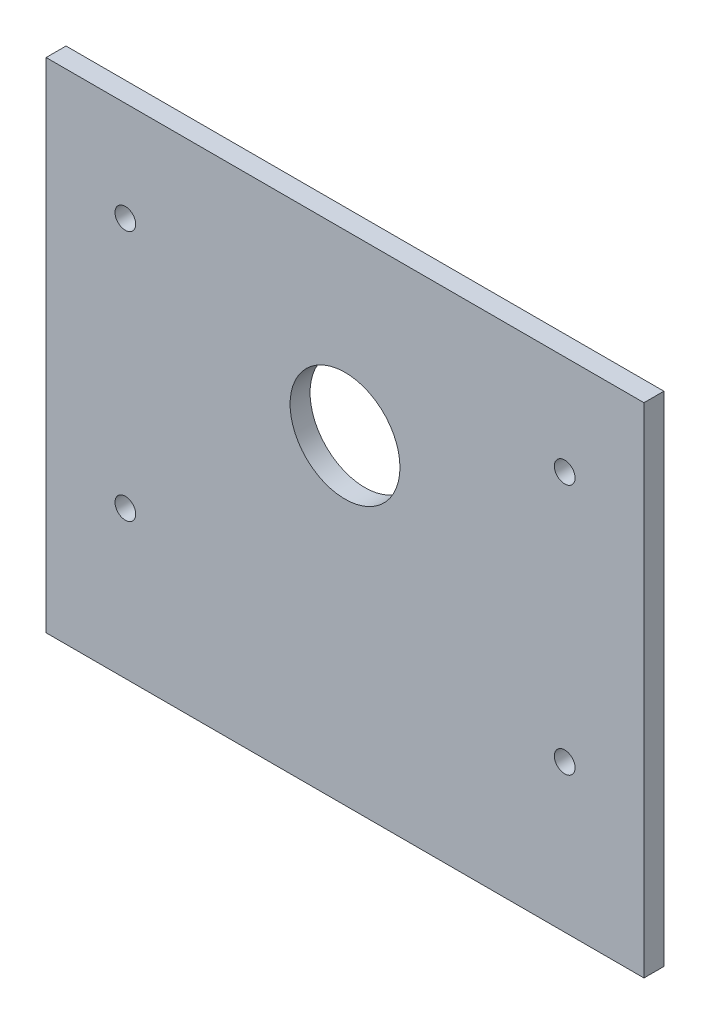
ISO-10303-21;
HEADER;
FILE_DESCRIPTION(('STEP AP214'),'2;1');
FILE_NAME('part.step','',(''),(''),'','','');
FILE_SCHEMA(('AUTOMOTIVE_DESIGN { 1 0 10303 214 1 1 1 1 }'));
ENDSEC;
DATA;
#1=APPLICATION_CONTEXT('core data for automotive mechanical design processes');
#2=APPLICATION_PROTOCOL_DEFINITION('international standard','automotive_design',2000,#1);
#3=PRODUCT_CONTEXT('',#1,'mechanical');
#4=PRODUCT('Part','Part','',(#3));
#5=PRODUCT_RELATED_PRODUCT_CATEGORY('part','',(#4));
#6=PRODUCT_DEFINITION_FORMATION('','',#4);
#7=PRODUCT_DEFINITION_CONTEXT('part definition',#1,'design');
#8=PRODUCT_DEFINITION('design','',#6,#7);
#9=PRODUCT_DEFINITION_SHAPE('','',#8);
#10=(LENGTH_UNIT() NAMED_UNIT(*) SI_UNIT(.MILLI.,.METRE.));
#11=(NAMED_UNIT(*) PLANE_ANGLE_UNIT() SI_UNIT($,.RADIAN.));
#12=(NAMED_UNIT(*) SI_UNIT($,.STERADIAN.) SOLID_ANGLE_UNIT());
#13=UNCERTAINTY_MEASURE_WITH_UNIT(LENGTH_MEASURE(1.E-05),#10,'distance_accuracy_value','');
#14=(GEOMETRIC_REPRESENTATION_CONTEXT(3) GLOBAL_UNCERTAINTY_ASSIGNED_CONTEXT((#13)) GLOBAL_UNIT_ASSIGNED_CONTEXT((#10,
#11,#12)) REPRESENTATION_CONTEXT('',''));
#15=CARTESIAN_POINT('',(0.,0.,0.));
#16=DIRECTION('',(0.,0.,1.));
#17=DIRECTION('',(1.,0.,0.));
#18=AXIS2_PLACEMENT_3D('',#15,#16,#17);
#19=CARTESIAN_POINT('',(38.1,-31.75,-2.54));
#20=DIRECTION('',(1.,0.,0.));
#21=DIRECTION('',(0.,0.,-1.));
#22=AXIS2_PLACEMENT_3D('',#19,#20,#21);
#23=PLANE('',#22);
#24=DIRECTION('',(0.,1.,0.));
#25=VECTOR('',#24,1.);
#26=CARTESIAN_POINT('',(38.1,-31.75,0.));
#27=LINE('',#26,#25);
#28=CARTESIAN_POINT('',(38.1,-31.75,0.));
#29=VERTEX_POINT('',#28);
#30=CARTESIAN_POINT('',(38.1,31.75,0.));
#31=VERTEX_POINT('',#30);
#32=EDGE_CURVE('E98',#29,#31,#27,.T.);
#33=ORIENTED_EDGE('',*,*,#32,.F.);
#34=DIRECTION('',(0.,0.,1.));
#35=VECTOR('',#34,1.);
#36=CARTESIAN_POINT('',(38.1,-31.75,-2.54));
#37=LINE('',#36,#35);
#38=CARTESIAN_POINT('',(38.1,-31.75,-2.54));
#39=VERTEX_POINT('',#38);
#40=EDGE_CURVE('E11',#39,#29,#37,.T.);
#41=ORIENTED_EDGE('',*,*,#40,.F.);
#42=DIRECTION('',(0.,1.,0.));
#43=VECTOR('',#42,1.);
#44=CARTESIAN_POINT('',(38.1,-31.75,-2.54));
#45=LINE('',#44,#43);
#46=CARTESIAN_POINT('',(38.1,31.75,-2.54));
#47=VERTEX_POINT('',#46);
#48=EDGE_CURVE('E91',#39,#47,#45,.T.);
#49=ORIENTED_EDGE('',*,*,#48,.T.);
#50=DIRECTION('',(0.,0.,1.));
#51=VECTOR('',#50,1.);
#52=CARTESIAN_POINT('',(38.1,31.75,-2.54));
#53=LINE('',#52,#51);
#54=EDGE_CURVE('E36',#47,#31,#53,.T.);
#55=ORIENTED_EDGE('',*,*,#54,.T.);
#56=EDGE_LOOP('',(#33,#41,#49,#55));
#57=FACE_BOUND('',#56,.T.);
#58=ADVANCED_FACE('F33',(#57),#23,.T.);
#59=CARTESIAN_POINT('',(-38.1,-31.75,-2.54));
#60=DIRECTION('',(0.,-1.,0.));
#61=DIRECTION('',(0.,0.,-1.));
#62=AXIS2_PLACEMENT_3D('',#59,#60,#61);
#63=PLANE('',#62);
#64=DIRECTION('',(1.,0.,0.));
#65=VECTOR('',#64,1.);
#66=CARTESIAN_POINT('',(-38.1,-31.75,0.));
#67=LINE('',#66,#65);
#68=CARTESIAN_POINT('',(-38.1,-31.75,0.));
#69=VERTEX_POINT('',#68);
#70=EDGE_CURVE('E93',#69,#29,#67,.T.);
#71=ORIENTED_EDGE('',*,*,#70,.F.);
#72=DIRECTION('',(0.,0.,1.));
#73=VECTOR('',#72,1.);
#74=CARTESIAN_POINT('',(-38.1,-31.75,-2.54));
#75=LINE('',#74,#73);
#76=CARTESIAN_POINT('',(-38.1,-31.75,-2.54));
#77=VERTEX_POINT('',#76);
#78=EDGE_CURVE('E42',#77,#69,#75,.T.);
#79=ORIENTED_EDGE('',*,*,#78,.F.);
#80=DIRECTION('',(1.,0.,0.));
#81=VECTOR('',#80,1.);
#82=CARTESIAN_POINT('',(-38.1,-31.75,-2.54));
#83=LINE('',#82,#81);
#84=EDGE_CURVE('E88',#77,#39,#83,.T.);
#85=ORIENTED_EDGE('',*,*,#84,.T.);
#86=ORIENTED_EDGE('',*,*,#40,.T.);
#87=EDGE_LOOP('',(#71,#79,#85,#86));
#88=FACE_BOUND('',#87,.T.);
#89=ADVANCED_FACE('F109',(#88),#63,.T.);
#90=CARTESIAN_POINT('',(-38.1,-31.75,-2.54));
#91=DIRECTION('',(-1.,0.,0.));
#92=DIRECTION('',(0.,0.,1.));
#93=AXIS2_PLACEMENT_3D('',#90,#91,#92);
#94=PLANE('',#93);
#95=DIRECTION('',(0.,-1.,0.));
#96=VECTOR('',#95,1.);
#97=CARTESIAN_POINT('',(-38.1,-31.75,0.));
#98=LINE('',#97,#96);
#99=CARTESIAN_POINT('',(-38.1,31.75,0.));
#100=VERTEX_POINT('',#99);
#101=EDGE_CURVE('E83',#100,#69,#98,.T.);
#102=ORIENTED_EDGE('',*,*,#101,.F.);
#103=DIRECTION('',(0.,0.,1.));
#104=VECTOR('',#103,1.);
#105=CARTESIAN_POINT('',(-38.1,31.75,-2.54));
#106=LINE('',#105,#104);
#107=CARTESIAN_POINT('',(-38.1,31.75,-2.54));
#108=VERTEX_POINT('',#107);
#109=EDGE_CURVE('E78',#108,#100,#106,.T.);
#110=ORIENTED_EDGE('',*,*,#109,.F.);
#111=DIRECTION('',(0.,-1.,0.));
#112=VECTOR('',#111,1.);
#113=CARTESIAN_POINT('',(-38.1,-31.75,-2.54));
#114=LINE('',#113,#112);
#115=EDGE_CURVE('E81',#108,#77,#114,.T.);
#116=ORIENTED_EDGE('',*,*,#115,.T.);
#117=ORIENTED_EDGE('',*,*,#78,.T.);
#118=EDGE_LOOP('',(#102,#110,#116,#117));
#119=FACE_BOUND('',#118,.T.);
#120=ADVANCED_FACE('F80',(#119),#94,.T.);
#121=CARTESIAN_POINT('',(-38.1,31.75,-2.54));
#122=DIRECTION('',(0.,1.,0.));
#123=DIRECTION('',(0.,0.,1.));
#124=AXIS2_PLACEMENT_3D('',#121,#122,#123);
#125=PLANE('',#124);
#126=DIRECTION('',(-1.,0.,0.));
#127=VECTOR('',#126,1.);
#128=CARTESIAN_POINT('',(-38.1,31.75,0.));
#129=LINE('',#128,#127);
#130=EDGE_CURVE('E101',#31,#100,#129,.T.);
#131=ORIENTED_EDGE('',*,*,#130,.F.);
#132=ORIENTED_EDGE('',*,*,#54,.F.);
#133=DIRECTION('',(-1.,0.,0.));
#134=VECTOR('',#133,1.);
#135=CARTESIAN_POINT('',(-38.1,31.75,-2.54));
#136=LINE('',#135,#134);
#137=EDGE_CURVE('E87',#47,#108,#136,.T.);
#138=ORIENTED_EDGE('',*,*,#137,.T.);
#139=ORIENTED_EDGE('',*,*,#109,.T.);
#140=EDGE_LOOP('',(#131,#132,#138,#139));
#141=FACE_BOUND('',#140,.T.);
#142=ADVANCED_FACE('F90',(#141),#125,.T.);
#143=CARTESIAN_POINT('',(0.,0.,-2.54));
#144=DIRECTION('',(0.,0.,-1.));
#145=DIRECTION('',(-1.,0.,0.));
#146=AXIS2_PLACEMENT_3D('',#143,#144,#145);
#147=PLANE('',#146);
#148=CARTESIAN_POINT('',(0.,9.05,-2.54));
#149=DIRECTION('',(0.,0.,1.));
#150=DIRECTION('',(1.,0.,0.));
#151=AXIS2_PLACEMENT_3D('',#148,#149,#150);
#152=CIRCLE('',#151,7.);
#153=CARTESIAN_POINT('',(7.,9.05,-2.54));
#154=VERTEX_POINT('',#153);
#155=EDGE_CURVE('E154',#154,#154,#152,.T.);
#156=ORIENTED_EDGE('',*,*,#155,.T.);
#157=EDGE_LOOP('',(#156));
#158=FACE_BOUND('',#157,.T.);
#159=CARTESIAN_POINT('',(28.,-12.95,-2.54));
#160=DIRECTION('',(0.,0.,1.));
#161=DIRECTION('',(1.,0.,0.));
#162=AXIS2_PLACEMENT_3D('',#159,#160,#161);
#163=CIRCLE('',#162,1.3208);
#164=CARTESIAN_POINT('',(29.3208,-12.95,-2.54));
#165=VERTEX_POINT('',#164);
#166=EDGE_CURVE('E162',#165,#165,#163,.T.);
#167=ORIENTED_EDGE('',*,*,#166,.T.);
#168=EDGE_LOOP('',(#167));
#169=FACE_BOUND('',#168,.T.);
#170=CARTESIAN_POINT('',(-28.,-12.95,-2.54));
#171=DIRECTION('',(0.,0.,1.));
#172=DIRECTION('',(1.,0.,0.));
#173=AXIS2_PLACEMENT_3D('',#170,#171,#172);
#174=CIRCLE('',#173,1.3208);
#175=CARTESIAN_POINT('',(-26.6792,-12.95,-2.54));
#176=VERTEX_POINT('',#175);
#177=EDGE_CURVE('E168',#176,#176,#174,.T.);
#178=ORIENTED_EDGE('',*,*,#177,.T.);
#179=EDGE_LOOP('',(#178));
#180=FACE_BOUND('',#179,.T.);
#181=CARTESIAN_POINT('',(28.,19.05,-2.54));
#182=DIRECTION('',(0.,0.,1.));
#183=DIRECTION('',(1.,0.,0.));
#184=AXIS2_PLACEMENT_3D('',#181,#182,#183);
#185=CIRCLE('',#184,1.3208);
#186=CARTESIAN_POINT('',(29.3208,19.05,-2.54));
#187=VERTEX_POINT('',#186);
#188=EDGE_CURVE('E174',#187,#187,#185,.T.);
#189=ORIENTED_EDGE('',*,*,#188,.T.);
#190=EDGE_LOOP('',(#189));
#191=FACE_BOUND('',#190,.T.);
#192=CARTESIAN_POINT('',(-28.,19.05,-2.54));
#193=DIRECTION('',(0.,0.,1.));
#194=DIRECTION('',(1.,0.,0.));
#195=AXIS2_PLACEMENT_3D('',#192,#193,#194);
#196=CIRCLE('',#195,1.3208);
#197=CARTESIAN_POINT('',(-26.6792,19.05,-2.54));
#198=VERTEX_POINT('',#197);
#199=EDGE_CURVE('E102',#198,#198,#196,.T.);
#200=ORIENTED_EDGE('',*,*,#199,.T.);
#201=EDGE_LOOP('',(#200));
#202=FACE_BOUND('',#201,.T.);
#203=ORIENTED_EDGE('',*,*,#48,.F.);
#204=ORIENTED_EDGE('',*,*,#84,.F.);
#205=ORIENTED_EDGE('',*,*,#115,.F.);
#206=ORIENTED_EDGE('',*,*,#137,.F.);
#207=EDGE_LOOP('',(#203,#204,#205,#206));
#208=FACE_BOUND('',#207,.T.);
#209=ADVANCED_FACE('F86',(#158,#169,#180,#191,#202,#208),#147,.T.);
#210=CARTESIAN_POINT('',(0.,0.,0.));
#211=DIRECTION('',(0.,0.,-1.));
#212=DIRECTION('',(-1.,0.,0.));
#213=AXIS2_PLACEMENT_3D('',#210,#211,#212);
#214=PLANE('',#213);
#215=CARTESIAN_POINT('',(0.,9.05,0.));
#216=DIRECTION('',(0.,0.,1.));
#217=DIRECTION('',(1.,0.,0.));
#218=AXIS2_PLACEMENT_3D('',#215,#216,#217);
#219=CIRCLE('',#218,7.);
#220=CARTESIAN_POINT('',(7.,9.05,0.));
#221=VERTEX_POINT('',#220);
#222=EDGE_CURVE('E157',#221,#221,#219,.T.);
#223=ORIENTED_EDGE('',*,*,#222,.F.);
#224=EDGE_LOOP('',(#223));
#225=FACE_BOUND('',#224,.T.);
#226=CARTESIAN_POINT('',(28.,-12.95,0.));
#227=DIRECTION('',(0.,0.,1.));
#228=DIRECTION('',(1.,0.,0.));
#229=AXIS2_PLACEMENT_3D('',#226,#227,#228);
#230=CIRCLE('',#229,1.3208);
#231=CARTESIAN_POINT('',(29.3208,-12.95,0.));
#232=VERTEX_POINT('',#231);
#233=EDGE_CURVE('E159',#232,#232,#230,.T.);
#234=ORIENTED_EDGE('',*,*,#233,.F.);
#235=EDGE_LOOP('',(#234));
#236=FACE_BOUND('',#235,.T.);
#237=CARTESIAN_POINT('',(-28.,-12.95,0.));
#238=DIRECTION('',(0.,0.,1.));
#239=DIRECTION('',(1.,0.,0.));
#240=AXIS2_PLACEMENT_3D('',#237,#238,#239);
#241=CIRCLE('',#240,1.3208);
#242=CARTESIAN_POINT('',(-26.6792,-12.95,0.));
#243=VERTEX_POINT('',#242);
#244=EDGE_CURVE('E165',#243,#243,#241,.T.);
#245=ORIENTED_EDGE('',*,*,#244,.F.);
#246=EDGE_LOOP('',(#245));
#247=FACE_BOUND('',#246,.T.);
#248=CARTESIAN_POINT('',(28.,19.05,0.));
#249=DIRECTION('',(0.,0.,1.));
#250=DIRECTION('',(1.,0.,0.));
#251=AXIS2_PLACEMENT_3D('',#248,#249,#250);
#252=CIRCLE('',#251,1.3208);
#253=CARTESIAN_POINT('',(29.3208,19.05,0.));
#254=VERTEX_POINT('',#253);
#255=EDGE_CURVE('E171',#254,#254,#252,.T.);
#256=ORIENTED_EDGE('',*,*,#255,.F.);
#257=EDGE_LOOP('',(#256));
#258=FACE_BOUND('',#257,.T.);
#259=CARTESIAN_POINT('',(-28.,19.05,0.));
#260=DIRECTION('',(0.,0.,1.));
#261=DIRECTION('',(1.,0.,0.));
#262=AXIS2_PLACEMENT_3D('',#259,#260,#261);
#263=CIRCLE('',#262,1.3208);
#264=CARTESIAN_POINT('',(-26.6792,19.05,0.));
#265=VERTEX_POINT('',#264);
#266=EDGE_CURVE('E177',#265,#265,#263,.T.);
#267=ORIENTED_EDGE('',*,*,#266,.F.);
#268=EDGE_LOOP('',(#267));
#269=FACE_BOUND('',#268,.T.);
#270=ORIENTED_EDGE('',*,*,#32,.T.);
#271=ORIENTED_EDGE('',*,*,#130,.T.);
#272=ORIENTED_EDGE('',*,*,#101,.T.);
#273=ORIENTED_EDGE('',*,*,#70,.T.);
#274=EDGE_LOOP('',(#270,#271,#272,#273));
#275=FACE_BOUND('',#274,.T.);
#276=ADVANCED_FACE('F108',(#225,#236,#247,#258,#269,#275),#214,.F.);
#277=CARTESIAN_POINT('',(-28.,19.05,-2.54));
#278=DIRECTION('',(0.,0.,1.));
#279=DIRECTION('',(1.,0.,0.));
#280=AXIS2_PLACEMENT_3D('',#277,#278,#279);
#281=CYLINDRICAL_SURFACE('',#280,1.3208);
#282=ORIENTED_EDGE('',*,*,#199,.F.);
#283=EDGE_LOOP('',(#282));
#284=FACE_BOUND('',#283,.T.);
#285=ORIENTED_EDGE('',*,*,#266,.T.);
#286=EDGE_LOOP('',(#285));
#287=FACE_BOUND('',#286,.T.);
#288=ADVANCED_FACE('F127',(#284,#287),#281,.F.);
#289=CARTESIAN_POINT('',(28.,19.05,-2.54));
#290=DIRECTION('',(0.,0.,1.));
#291=DIRECTION('',(1.,0.,0.));
#292=AXIS2_PLACEMENT_3D('',#289,#290,#291);
#293=CYLINDRICAL_SURFACE('',#292,1.3208);
#294=ORIENTED_EDGE('',*,*,#188,.F.);
#295=EDGE_LOOP('',(#294));
#296=FACE_BOUND('',#295,.T.);
#297=ORIENTED_EDGE('',*,*,#255,.T.);
#298=EDGE_LOOP('',(#297));
#299=FACE_BOUND('',#298,.T.);
#300=ADVANCED_FACE('F134',(#296,#299),#293,.F.);
#301=CARTESIAN_POINT('',(-28.,-12.95,-2.54));
#302=DIRECTION('',(0.,0.,1.));
#303=DIRECTION('',(1.,0.,0.));
#304=AXIS2_PLACEMENT_3D('',#301,#302,#303);
#305=CYLINDRICAL_SURFACE('',#304,1.3208);
#306=ORIENTED_EDGE('',*,*,#177,.F.);
#307=EDGE_LOOP('',(#306));
#308=FACE_BOUND('',#307,.T.);
#309=ORIENTED_EDGE('',*,*,#244,.T.);
#310=EDGE_LOOP('',(#309));
#311=FACE_BOUND('',#310,.T.);
#312=ADVANCED_FACE('F138',(#308,#311),#305,.F.);
#313=CARTESIAN_POINT('',(28.,-12.95,-2.54));
#314=DIRECTION('',(0.,0.,1.));
#315=DIRECTION('',(1.,0.,0.));
#316=AXIS2_PLACEMENT_3D('',#313,#314,#315);
#317=CYLINDRICAL_SURFACE('',#316,1.3208);
#318=ORIENTED_EDGE('',*,*,#166,.F.);
#319=EDGE_LOOP('',(#318));
#320=FACE_BOUND('',#319,.T.);
#321=ORIENTED_EDGE('',*,*,#233,.T.);
#322=EDGE_LOOP('',(#321));
#323=FACE_BOUND('',#322,.T.);
#324=ADVANCED_FACE('F142',(#320,#323),#317,.F.);
#325=CARTESIAN_POINT('',(0.,9.05,-2.54));
#326=DIRECTION('',(0.,0.,1.));
#327=DIRECTION('',(1.,0.,0.));
#328=AXIS2_PLACEMENT_3D('',#325,#326,#327);
#329=CYLINDRICAL_SURFACE('',#328,7.);
#330=ORIENTED_EDGE('',*,*,#155,.F.);
#331=EDGE_LOOP('',(#330));
#332=FACE_BOUND('',#331,.T.);
#333=ORIENTED_EDGE('',*,*,#222,.T.);
#334=EDGE_LOOP('',(#333));
#335=FACE_BOUND('',#334,.T.);
#336=ADVANCED_FACE('F146',(#332,#335),#329,.F.);
#337=CLOSED_SHELL('',(#58,#89,#120,#142,#209,#276,#288,#300,#312,#324,#336));
#338=MANIFOLD_SOLID_BREP('B2',#337);
#339=ADVANCED_BREP_SHAPE_REPRESENTATION('',(#18,#338),#14);
#340=SHAPE_DEFINITION_REPRESENTATION(#9,#339);
ENDSEC;
END-ISO-10303-21;
